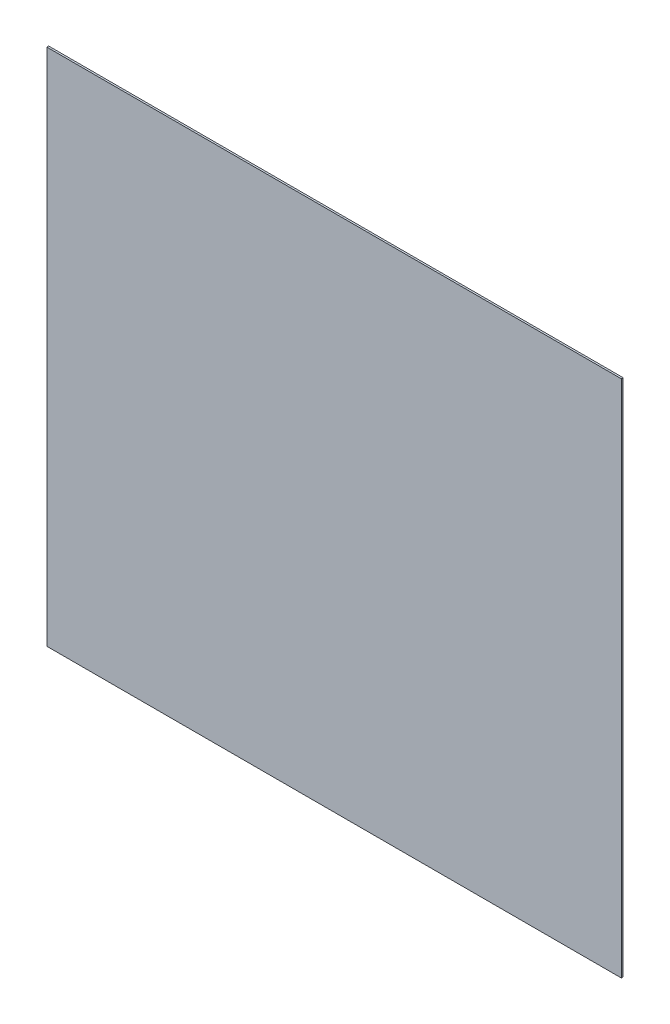
ISO-10303-21;
HEADER;
FILE_DESCRIPTION(('STEP AP214'),'2;1');
FILE_NAME('part.step','',(''),(''),'','','');
FILE_SCHEMA(('AUTOMOTIVE_DESIGN { 1 0 10303 214 1 1 1 1 }'));
ENDSEC;
DATA;
#1=APPLICATION_CONTEXT('core data for automotive mechanical design processes');
#2=APPLICATION_PROTOCOL_DEFINITION('international standard','automotive_design',2000,#1);
#3=PRODUCT_CONTEXT('',#1,'mechanical');
#4=PRODUCT('Part','Part','',(#3));
#5=PRODUCT_RELATED_PRODUCT_CATEGORY('part','',(#4));
#6=PRODUCT_DEFINITION_FORMATION('','',#4);
#7=PRODUCT_DEFINITION_CONTEXT('part definition',#1,'design');
#8=PRODUCT_DEFINITION('design','',#6,#7);
#9=PRODUCT_DEFINITION_SHAPE('','',#8);
#10=(LENGTH_UNIT() NAMED_UNIT(*) SI_UNIT(.MILLI.,.METRE.));
#11=(NAMED_UNIT(*) PLANE_ANGLE_UNIT() SI_UNIT($,.RADIAN.));
#12=(NAMED_UNIT(*) SI_UNIT($,.STERADIAN.) SOLID_ANGLE_UNIT());
#13=UNCERTAINTY_MEASURE_WITH_UNIT(LENGTH_MEASURE(1.E-05),#10,'distance_accuracy_value','');
#14=(GEOMETRIC_REPRESENTATION_CONTEXT(3) GLOBAL_UNCERTAINTY_ASSIGNED_CONTEXT((#13)) GLOBAL_UNIT_ASSIGNED_CONTEXT((#10,
#11,#12)) REPRESENTATION_CONTEXT('',''));
#15=CARTESIAN_POINT('',(0.,0.,0.));
#16=DIRECTION('',(0.,0.,1.));
#17=DIRECTION('',(1.,0.,0.));
#18=AXIS2_PLACEMENT_3D('',#15,#16,#17);
#19=CARTESIAN_POINT('',(0.,0.,2.54));
#20=DIRECTION('',(1.,0.,0.));
#21=DIRECTION('',(0.,0.,-1.));
#22=AXIS2_PLACEMENT_3D('',#19,#20,#21);
#23=PLANE('',#22);
#24=DIRECTION('',(0.,-1.,0.));
#25=VECTOR('',#24,1.);
#26=CARTESIAN_POINT('',(0.,0.,0.));
#27=LINE('',#26,#25);
#28=CARTESIAN_POINT('',(0.,711.2,0.));
#29=VERTEX_POINT('',#28);
#30=CARTESIAN_POINT('',(0.,0.,0.));
#31=VERTEX_POINT('',#30);
#32=EDGE_CURVE('E107',#29,#31,#27,.T.);
#33=ORIENTED_EDGE('',*,*,#32,.T.);
#34=DIRECTION('',(0.,0.,-1.));
#35=VECTOR('',#34,1.);
#36=CARTESIAN_POINT('',(0.,0.,2.54));
#37=LINE('',#36,#35);
#38=CARTESIAN_POINT('',(0.,0.,2.54));
#39=VERTEX_POINT('',#38);
#40=EDGE_CURVE('E11',#39,#31,#37,.T.);
#41=ORIENTED_EDGE('',*,*,#40,.F.);
#42=DIRECTION('',(0.,-1.,0.));
#43=VECTOR('',#42,1.);
#44=CARTESIAN_POINT('',(0.,0.,2.54));
#45=LINE('',#44,#43);
#46=CARTESIAN_POINT('',(0.,711.2,2.54));
#47=VERTEX_POINT('',#46);
#48=EDGE_CURVE('E91',#47,#39,#45,.T.);
#49=ORIENTED_EDGE('',*,*,#48,.F.);
#50=DIRECTION('',(0.,0.,-1.));
#51=VECTOR('',#50,1.);
#52=CARTESIAN_POINT('',(0.,711.2,2.54));
#53=LINE('',#52,#51);
#54=EDGE_CURVE('E103',#47,#29,#53,.T.);
#55=ORIENTED_EDGE('',*,*,#54,.T.);
#56=EDGE_LOOP('',(#33,#41,#49,#55));
#57=FACE_BOUND('',#56,.T.);
#58=ADVANCED_FACE('F39',(#57),#23,.F.);
#59=CARTESIAN_POINT('',(0.,0.,2.54));
#60=DIRECTION('',(0.,1.,0.));
#61=DIRECTION('',(0.,0.,1.));
#62=AXIS2_PLACEMENT_3D('',#59,#60,#61);
#63=PLANE('',#62);
#64=DIRECTION('',(1.,0.,0.));
#65=VECTOR('',#64,1.);
#66=CARTESIAN_POINT('',(0.,0.,0.));
#67=LINE('',#66,#65);
#68=CARTESIAN_POINT('',(787.4,0.,0.));
#69=VERTEX_POINT('',#68);
#70=EDGE_CURVE('E96',#31,#69,#67,.T.);
#71=ORIENTED_EDGE('',*,*,#70,.T.);
#72=DIRECTION('',(0.,0.,-1.));
#73=VECTOR('',#72,1.);
#74=CARTESIAN_POINT('',(787.4,0.,2.54));
#75=LINE('',#74,#73);
#76=CARTESIAN_POINT('',(787.4,0.,2.54));
#77=VERTEX_POINT('',#76);
#78=EDGE_CURVE('E48',#77,#69,#75,.T.);
#79=ORIENTED_EDGE('',*,*,#78,.F.);
#80=DIRECTION('',(1.,0.,0.));
#81=VECTOR('',#80,1.);
#82=CARTESIAN_POINT('',(0.,0.,2.54));
#83=LINE('',#82,#81);
#84=EDGE_CURVE('E86',#39,#77,#83,.T.);
#85=ORIENTED_EDGE('',*,*,#84,.F.);
#86=ORIENTED_EDGE('',*,*,#40,.T.);
#87=EDGE_LOOP('',(#71,#79,#85,#86));
#88=FACE_BOUND('',#87,.T.);
#89=ADVANCED_FACE('F95',(#88),#63,.F.);
#90=CARTESIAN_POINT('',(787.4,0.,2.54));
#91=DIRECTION('',(-1.,0.,0.));
#92=DIRECTION('',(0.,0.,1.));
#93=AXIS2_PLACEMENT_3D('',#90,#91,#92);
#94=PLANE('',#93);
#95=DIRECTION('',(0.,1.,0.));
#96=VECTOR('',#95,1.);
#97=CARTESIAN_POINT('',(787.4,0.,0.));
#98=LINE('',#97,#96);
#99=CARTESIAN_POINT('',(787.4,711.2,0.));
#100=VERTEX_POINT('',#99);
#101=EDGE_CURVE('E73',#69,#100,#98,.T.);
#102=ORIENTED_EDGE('',*,*,#101,.T.);
#103=DIRECTION('',(0.,0.,-1.));
#104=VECTOR('',#103,1.);
#105=CARTESIAN_POINT('',(787.4,711.2,2.54));
#106=LINE('',#105,#104);
#107=CARTESIAN_POINT('',(787.4,711.2,2.54));
#108=VERTEX_POINT('',#107);
#109=EDGE_CURVE('E98',#108,#100,#106,.T.);
#110=ORIENTED_EDGE('',*,*,#109,.F.);
#111=DIRECTION('',(0.,1.,0.));
#112=VECTOR('',#111,1.);
#113=CARTESIAN_POINT('',(787.4,0.,2.54));
#114=LINE('',#113,#112);
#115=EDGE_CURVE('E89',#77,#108,#114,.T.);
#116=ORIENTED_EDGE('',*,*,#115,.F.);
#117=ORIENTED_EDGE('',*,*,#78,.T.);
#118=EDGE_LOOP('',(#102,#110,#116,#117));
#119=FACE_BOUND('',#118,.T.);
#120=ADVANCED_FACE('F99',(#119),#94,.F.);
#121=CARTESIAN_POINT('',(0.,711.2,2.54));
#122=DIRECTION('',(0.,-1.,0.));
#123=DIRECTION('',(0.,0.,-1.));
#124=AXIS2_PLACEMENT_3D('',#121,#122,#123);
#125=PLANE('',#124);
#126=DIRECTION('',(-1.,0.,0.));
#127=VECTOR('',#126,1.);
#128=CARTESIAN_POINT('',(0.,711.2,0.));
#129=LINE('',#128,#127);
#130=EDGE_CURVE('E79',#100,#29,#129,.T.);
#131=ORIENTED_EDGE('',*,*,#130,.T.);
#132=ORIENTED_EDGE('',*,*,#54,.F.);
#133=DIRECTION('',(-1.,0.,0.));
#134=VECTOR('',#133,1.);
#135=CARTESIAN_POINT('',(0.,711.2,2.54));
#136=LINE('',#135,#134);
#137=EDGE_CURVE('E56',#108,#47,#136,.T.);
#138=ORIENTED_EDGE('',*,*,#137,.F.);
#139=ORIENTED_EDGE('',*,*,#109,.T.);
#140=EDGE_LOOP('',(#131,#132,#138,#139));
#141=FACE_BOUND('',#140,.T.);
#142=ADVANCED_FACE('F120',(#141),#125,.F.);
#143=CARTESIAN_POINT('',(0.,0.,2.54));
#144=DIRECTION('',(0.,0.,-1.));
#145=DIRECTION('',(-1.,0.,0.));
#146=AXIS2_PLACEMENT_3D('',#143,#144,#145);
#147=PLANE('',#146);
#148=ORIENTED_EDGE('',*,*,#48,.T.);
#149=ORIENTED_EDGE('',*,*,#84,.T.);
#150=ORIENTED_EDGE('',*,*,#115,.T.);
#151=ORIENTED_EDGE('',*,*,#137,.T.);
#152=EDGE_LOOP('',(#148,#149,#150,#151));
#153=FACE_BOUND('',#152,.T.);
#154=ADVANCED_FACE('F87',(#153),#147,.F.);
#155=CARTESIAN_POINT('',(0.,0.,0.));
#156=DIRECTION('',(0.,0.,-1.));
#157=DIRECTION('',(-1.,0.,0.));
#158=AXIS2_PLACEMENT_3D('',#155,#156,#157);
#159=PLANE('',#158);
#160=ORIENTED_EDGE('',*,*,#32,.F.);
#161=ORIENTED_EDGE('',*,*,#130,.F.);
#162=ORIENTED_EDGE('',*,*,#101,.F.);
#163=ORIENTED_EDGE('',*,*,#70,.F.);
#164=EDGE_LOOP('',(#160,#161,#162,#163));
#165=FACE_BOUND('',#164,.T.);
#166=ADVANCED_FACE('F123',(#165),#159,.T.);
#167=CLOSED_SHELL('',(#58,#89,#120,#142,#154,#166));
#168=MANIFOLD_SOLID_BREP('B2',#167);
#169=ADVANCED_BREP_SHAPE_REPRESENTATION('',(#18,#168),#14);
#170=SHAPE_DEFINITION_REPRESENTATION(#9,#169);
ENDSEC;
END-ISO-10303-21;
